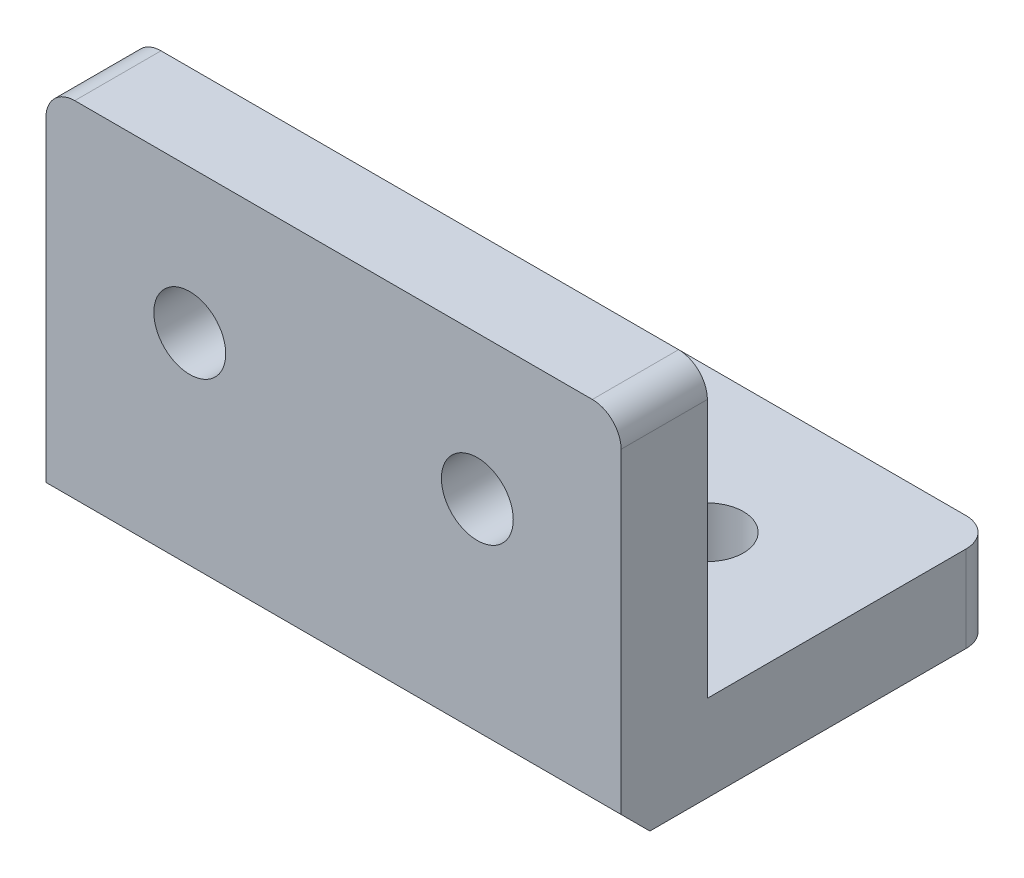
ISO-10303-21;
HEADER;
FILE_DESCRIPTION(('STEP AP214'),'2;1');
FILE_NAME('part.step','',(''),(''),'','','');
FILE_SCHEMA(('AUTOMOTIVE_DESIGN { 1 0 10303 214 1 1 1 1 }'));
ENDSEC;
DATA;
#1=APPLICATION_CONTEXT('core data for automotive mechanical design processes');
#2=APPLICATION_PROTOCOL_DEFINITION('international standard','automotive_design',2000,#1);
#3=PRODUCT_CONTEXT('',#1,'mechanical');
#4=PRODUCT('Part','Part','',(#3));
#5=PRODUCT_RELATED_PRODUCT_CATEGORY('part','',(#4));
#6=PRODUCT_DEFINITION_FORMATION('','',#4);
#7=PRODUCT_DEFINITION_CONTEXT('part definition',#1,'design');
#8=PRODUCT_DEFINITION('design','',#6,#7);
#9=PRODUCT_DEFINITION_SHAPE('','',#8);
#10=(LENGTH_UNIT() NAMED_UNIT(*) SI_UNIT(.MILLI.,.METRE.));
#11=(NAMED_UNIT(*) PLANE_ANGLE_UNIT() SI_UNIT($,.RADIAN.));
#12=(NAMED_UNIT(*) SI_UNIT($,.STERADIAN.) SOLID_ANGLE_UNIT());
#13=UNCERTAINTY_MEASURE_WITH_UNIT(LENGTH_MEASURE(1.E-05),#10,'distance_accuracy_value','');
#14=(GEOMETRIC_REPRESENTATION_CONTEXT(3) GLOBAL_UNCERTAINTY_ASSIGNED_CONTEXT((#13)) GLOBAL_UNIT_ASSIGNED_CONTEXT((#10,
#11,#12)) REPRESENTATION_CONTEXT('',''));
#15=CARTESIAN_POINT('',(0.,0.,0.));
#16=DIRECTION('',(0.,0.,1.));
#17=DIRECTION('',(1.,0.,0.));
#18=AXIS2_PLACEMENT_3D('',#15,#16,#17);
#19=CARTESIAN_POINT('',(-19.9999999999968,-9.25000000000114,6.00000000000178));
#20=DIRECTION('',(1.00000000000008,0.,0.));
#21=DIRECTION('',(0.,1.,0.));
#22=AXIS2_PLACEMENT_3D('',#19,#20,#21);
#23=PLANE('',#22);
#24=DIRECTION('',(0.,0.,1.));
#25=VECTOR('',#24,1.);
#26=CARTESIAN_POINT('',(-20.0000000000049,-15.2499999999981,-20.0000000000016));
#27=LINE('',#26,#25);
#28=CARTESIAN_POINT('',(-19.9999999999988,-15.2499999999955,-18.0000000000015));
#29=VERTEX_POINT('',#28);
#30=CARTESIAN_POINT('',(-19.9999999999968,-15.2500000000014,4.00000000000156));
#31=VERTEX_POINT('',#30);
#32=EDGE_CURVE('E144',#29,#31,#27,.T.);
#33=ORIENTED_EDGE('',*,*,#32,.T.);
#34=DIRECTION('',(0.,0.707106781186552,0.707106781186555));
#35=VECTOR('',#34,1.);
#36=CARTESIAN_POINT('',(-19.999999999998,-13.2500000000011,5.99999999999795));
#37=LINE('',#36,#35);
#38=CARTESIAN_POINT('',(-19.999999999998,-13.2500000000011,5.99999999999795));
#39=VERTEX_POINT('',#38);
#40=EDGE_CURVE('E11',#31,#39,#37,.T.);
#41=ORIENTED_EDGE('',*,*,#40,.T.);
#42=DIRECTION('',(0.,-1.,0.));
#43=VECTOR('',#42,1.);
#44=CARTESIAN_POINT('',(-19.9999999999968,-9.25000000000114,6.00000000000178));
#45=LINE('',#44,#43);
#46=CARTESIAN_POINT('',(-19.9999999999984,8.75000000000076,5.999999999999));
#47=VERTEX_POINT('',#46);
#48=EDGE_CURVE('E204',#47,#39,#45,.T.);
#49=ORIENTED_EDGE('',*,*,#48,.F.);
#50=DIRECTION('',(0.,0.,-1.));
#51=VECTOR('',#50,1.);
#52=CARTESIAN_POINT('',(-19.9999999999984,8.75000000000076,5.999999999999));
#53=LINE('',#52,#51);
#54=CARTESIAN_POINT('',(-19.9999999999982,8.75000000000153,-9.99200722162641E-13));
#55=VERTEX_POINT('',#54);
#56=EDGE_CURVE('E224',#47,#55,#53,.T.);
#57=ORIENTED_EDGE('',*,*,#56,.T.);
#58=DIRECTION('',(0.,-1.,0.));
#59=VECTOR('',#58,1.);
#60=CARTESIAN_POINT('',(-19.9999999999974,-9.25000000000209,1.77635683940025E-12));
#61=LINE('',#60,#59);
#62=CARTESIAN_POINT('',(-19.9999999999974,-9.25000000000209,1.77635683940025E-12));
#63=VERTEX_POINT('',#62);
#64=EDGE_CURVE('E200',#55,#63,#61,.T.);
#65=ORIENTED_EDGE('',*,*,#64,.T.);
#66=DIRECTION('',(0.,0.,1.));
#67=VECTOR('',#66,1.);
#68=CARTESIAN_POINT('',(-20.0000000000016,-9.24999999999809,-20.));
#69=LINE('',#68,#67);
#70=CARTESIAN_POINT('',(-20.0000000000026,-9.24999999999548,-18.));
#71=VERTEX_POINT('',#70);
#72=EDGE_CURVE('E181',#71,#63,#69,.T.);
#73=ORIENTED_EDGE('',*,*,#72,.F.);
#74=DIRECTION('',(0.,-1.,0.));
#75=VECTOR('',#74,1.);
#76=CARTESIAN_POINT('',(-19.999999999999,10.7500000000049,-18.000000000003));
#77=LINE('',#76,#75);
#78=EDGE_CURVE('E146',#71,#29,#77,.T.);
#79=ORIENTED_EDGE('',*,*,#78,.T.);
#80=EDGE_LOOP('',(#33,#41,#49,#57,#65,#73,#79));
#81=FACE_BOUND('',#80,.T.);
#82=ADVANCED_FACE('F38',(#81),#23,.F.);
#83=CARTESIAN_POINT('',(20.0000000000066,-9.25000000000498,5.99999999999262));
#84=DIRECTION('',(-1.00000000000008,0.,0.));
#85=DIRECTION('',(0.,-1.,0.));
#86=AXIS2_PLACEMENT_3D('',#83,#84,#85);
#87=PLANE('',#86);
#88=DIRECTION('',(0.,1.,0.));
#89=VECTOR('',#88,1.);
#90=CARTESIAN_POINT('',(20.0000000000066,-9.25000000000498,5.99999999999262));
#91=LINE('',#90,#89);
#92=CARTESIAN_POINT('',(20.0000000000083,-13.250000000005,5.99999999998996));
#93=VERTEX_POINT('',#92);
#94=CARTESIAN_POINT('',(20.0000000000068,8.74999999999743,5.99999999999162));
#95=VERTEX_POINT('',#94);
#96=EDGE_CURVE('E208',#93,#95,#91,.T.);
#97=ORIENTED_EDGE('',*,*,#96,.F.);
#98=DIRECTION('',(0.,-0.707106781186552,-0.707106781186555));
#99=VECTOR('',#98,1.);
#100=CARTESIAN_POINT('',(20.0000000000083,-13.250000000005,5.99999999998996));
#101=LINE('',#100,#99);
#102=CARTESIAN_POINT('',(20.0000000000119,-15.250000000004,3.99999999999179));
#103=VERTEX_POINT('',#102);
#104=EDGE_CURVE('E268',#93,#103,#101,.T.);
#105=ORIENTED_EDGE('',*,*,#104,.T.);
#106=DIRECTION('',(0.,0.,1.));
#107=VECTOR('',#106,1.);
#108=CARTESIAN_POINT('',(19.9999999999986,-15.2500000000024,-20.0000000000082));
#109=LINE('',#108,#107);
#110=CARTESIAN_POINT('',(20.0000000000012,-15.2500000000017,-18.0000000000082));
#111=VERTEX_POINT('',#110);
#112=EDGE_CURVE('E175',#111,#103,#109,.T.);
#113=ORIENTED_EDGE('',*,*,#112,.F.);
#114=DIRECTION('',(0.,-1.,0.));
#115=VECTOR('',#114,1.);
#116=CARTESIAN_POINT('',(20.0000000000046,10.7500000000024,-18.0000000000118));
#117=LINE('',#116,#115);
#118=CARTESIAN_POINT('',(20.0000000000001,-9.25000000000215,-18.0000000000086));
#119=VERTEX_POINT('',#118);
#120=EDGE_CURVE('E147',#119,#111,#117,.T.);
#121=ORIENTED_EDGE('',*,*,#120,.F.);
#122=DIRECTION('',(0.,0.,1.));
#123=VECTOR('',#122,1.);
#124=CARTESIAN_POINT('',(20.0000000000028,-9.25000000000237,-20.0000000000086));
#125=LINE('',#124,#123);
#126=CARTESIAN_POINT('',(20.0000000000068,-9.25000000000215,-7.38298311375729E-12));
#127=VERTEX_POINT('',#126);
#128=EDGE_CURVE('E139',#119,#127,#125,.T.);
#129=ORIENTED_EDGE('',*,*,#128,.T.);
#130=DIRECTION('',(0.,1.,0.));
#131=VECTOR('',#130,1.);
#132=CARTESIAN_POINT('',(20.0000000000068,-9.25000000000215,-7.38298311375729E-12));
#133=LINE('',#132,#131);
#134=CARTESIAN_POINT('',(20.0000000000079,8.74999999999942,-8.38218383591993E-12));
#135=VERTEX_POINT('',#134);
#136=EDGE_CURVE('E231',#127,#135,#133,.T.);
#137=ORIENTED_EDGE('',*,*,#136,.T.);
#138=DIRECTION('',(0.,0.,-1.));
#139=VECTOR('',#138,1.);
#140=CARTESIAN_POINT('',(20.0000000000068,8.74999999999743,5.99999999999162));
#141=LINE('',#140,#139);
#142=EDGE_CURVE('E132',#95,#135,#141,.T.);
#143=ORIENTED_EDGE('',*,*,#142,.F.);
#144=EDGE_LOOP('',(#97,#105,#113,#121,#129,#137,#143));
#145=FACE_BOUND('',#144,.T.);
#146=ADVANCED_FACE('F319',(#145),#87,.F.);
#147=CARTESIAN_POINT('',(19.9999999999986,-15.2500000000024,-20.0000000000082));
#148=DIRECTION('',(0.,-1.,0.));
#149=DIRECTION('',(1.00000000000008,0.,0.));
#150=AXIS2_PLACEMENT_3D('',#147,#148,#149);
#151=PLANE('',#150);
#152=CARTESIAN_POINT('',(10.0000000000036,-15.2500000000013,-10.0000000000022));
#153=DIRECTION('',(0.,-1.,0.));
#154=DIRECTION('',(1.00000000000008,0.,0.));
#155=AXIS2_PLACEMENT_3D('',#152,#153,#154);
#156=CIRCLE('',#155,2.5);
#157=CARTESIAN_POINT('',(12.5000000000033,-15.2500000000012,-10.0000000000035));
#158=VERTEX_POINT('',#157);
#159=EDGE_CURVE('E152',#158,#158,#156,.T.);
#160=ORIENTED_EDGE('',*,*,#159,.F.);
#161=EDGE_LOOP('',(#160));
#162=FACE_BOUND('',#161,.T.);
#163=CARTESIAN_POINT('',(-10.0000000000051,-15.2500000000007,-10.0000000000026));
#164=DIRECTION('',(0.,-1.,0.));
#165=DIRECTION('',(1.00000000000008,0.,0.));
#166=AXIS2_PLACEMENT_3D('',#163,#164,#165);
#167=CIRCLE('',#166,2.5);
#168=CARTESIAN_POINT('',(-7.50000000000145,-15.2500000000006,-10.0000000000043));
#169=VERTEX_POINT('',#168);
#170=EDGE_CURVE('E161',#169,#169,#167,.T.);
#171=ORIENTED_EDGE('',*,*,#170,.F.);
#172=EDGE_LOOP('',(#171));
#173=FACE_BOUND('',#172,.T.);
#174=ORIENTED_EDGE('',*,*,#112,.T.);
#175=DIRECTION('',(-1.00000000000008,0.,0.));
#176=VECTOR('',#175,1.);
#177=CARTESIAN_POINT('',(-19.9999999999968,-15.2500000000014,4.00000000000156));
#178=LINE('',#177,#176);
#179=EDGE_CURVE('E47',#103,#31,#178,.T.);
#180=ORIENTED_EDGE('',*,*,#179,.T.);
#181=ORIENTED_EDGE('',*,*,#32,.F.);
#182=CARTESIAN_POINT('',(-17.9999999999988,-15.249999999998,-18.0000000000064));
#183=DIRECTION('',(0.,-1.,0.));
#184=DIRECTION('',(1.00000000000008,0.,0.));
#185=AXIS2_PLACEMENT_3D('',#182,#183,#184);
#186=CIRCLE('',#185,2.);
#187=CARTESIAN_POINT('',(-18.0000000000049,-15.2499999999986,-20.0000000000064));
#188=VERTEX_POINT('',#187);
#189=EDGE_CURVE('E124',#188,#29,#186,.F.);
#190=ORIENTED_EDGE('',*,*,#189,.F.);
#191=DIRECTION('',(1.00000000000008,0.,0.));
#192=VECTOR('',#191,1.);
#193=CARTESIAN_POINT('',(19.9999999999986,-15.2500000000024,-20.0000000000082));
#194=LINE('',#193,#192);
#195=CARTESIAN_POINT('',(17.9999999999986,-15.249999999999,-20.0000000000087));
#196=VERTEX_POINT('',#195);
#197=EDGE_CURVE('E135',#188,#196,#194,.T.);
#198=ORIENTED_EDGE('',*,*,#197,.T.);
#199=CARTESIAN_POINT('',(18.0000000000012,-15.2499999999965,-18.0000000000087));
#200=DIRECTION('',(0.,-1.,0.));
#201=DIRECTION('',(1.00000000000008,0.,0.));
#202=AXIS2_PLACEMENT_3D('',#199,#200,#201);
#203=CIRCLE('',#202,2.);
#204=EDGE_CURVE('E155',#196,#111,#203,.T.);
#205=ORIENTED_EDGE('',*,*,#204,.T.);
#206=EDGE_LOOP('',(#174,#180,#181,#190,#198,#205));
#207=FACE_BOUND('',#206,.T.);
#208=ADVANCED_FACE('F142',(#162,#173,#207),#151,.T.);
#209=CARTESIAN_POINT('',(20.0000000000028,-9.25000000000237,-20.0000000000086));
#210=DIRECTION('',(0.,1.,0.));
#211=DIRECTION('',(-1.00000000000008,0.,0.));
#212=AXIS2_PLACEMENT_3D('',#209,#210,#211);
#213=PLANE('',#212);
#214=CARTESIAN_POINT('',(9.99999999999979,-9.25000000000126,-10.0000000000037));
#215=DIRECTION('',(0.,1.,0.));
#216=DIRECTION('',(-1.00000000000008,0.,0.));
#217=AXIS2_PLACEMENT_3D('',#214,#215,#216);
#218=CIRCLE('',#217,2.5);
#219=CARTESIAN_POINT('',(12.5000000000033,-9.25000000000122,-10.0000000000034));
#220=VERTEX_POINT('',#219);
#221=EDGE_CURVE('E173',#220,#220,#218,.T.);
#222=ORIENTED_EDGE('',*,*,#221,.F.);
#223=EDGE_LOOP('',(#222));
#224=FACE_BOUND('',#223,.T.);
#225=CARTESIAN_POINT('',(-10.0000000000018,-9.25000000000065,-10.0000000000066));
#226=DIRECTION('',(0.,1.,0.));
#227=DIRECTION('',(-1.00000000000008,0.,0.));
#228=AXIS2_PLACEMENT_3D('',#225,#226,#227);
#229=CIRCLE('',#228,2.5);
#230=CARTESIAN_POINT('',(-7.50000000000153,-9.25000000000061,-10.0000000000043));
#231=VERTEX_POINT('',#230);
#232=EDGE_CURVE('E171',#231,#231,#229,.T.);
#233=ORIENTED_EDGE('',*,*,#232,.F.);
#234=EDGE_LOOP('',(#233));
#235=FACE_BOUND('',#234,.T.);
#236=ORIENTED_EDGE('',*,*,#128,.F.);
#237=CARTESIAN_POINT('',(18.0000000000001,-9.24999999999715,-18.0000000000111));
#238=DIRECTION('',(0.,1.,0.));
#239=DIRECTION('',(-1.00000000000008,0.,0.));
#240=AXIS2_PLACEMENT_3D('',#237,#238,#239);
#241=CIRCLE('',#240,2.);
#242=CARTESIAN_POINT('',(18.0000000000028,-9.24999999999898,-20.0000000000111));
#243=VERTEX_POINT('',#242);
#244=EDGE_CURVE('E167',#119,#243,#241,.T.);
#245=ORIENTED_EDGE('',*,*,#244,.T.);
#246=DIRECTION('',(-1.00000000000008,0.,0.));
#247=VECTOR('',#246,1.);
#248=CARTESIAN_POINT('',(20.0000000000028,-9.25000000000237,-20.0000000000086));
#249=LINE('',#248,#247);
#250=CARTESIAN_POINT('',(-18.0000000000016,-9.24999999999859,-20.0000000000058));
#251=VERTEX_POINT('',#250);
#252=EDGE_CURVE('E140',#243,#251,#249,.T.);
#253=ORIENTED_EDGE('',*,*,#252,.T.);
#254=CARTESIAN_POINT('',(-18.0000000000026,-9.24999999999798,-18.0000000000058));
#255=DIRECTION('',(0.,1.,0.));
#256=DIRECTION('',(-1.00000000000008,0.,0.));
#257=AXIS2_PLACEMENT_3D('',#254,#255,#256);
#258=CIRCLE('',#257,2.);
#259=EDGE_CURVE('E126',#71,#251,#258,.F.);
#260=ORIENTED_EDGE('',*,*,#259,.F.);
#261=ORIENTED_EDGE('',*,*,#72,.T.);
#262=DIRECTION('',(1.00000000000008,0.,0.));
#263=VECTOR('',#262,1.);
#264=CARTESIAN_POINT('',(-19.9999999999974,-9.25000000000209,1.77635683940025E-12));
#265=LINE('',#264,#263);
#266=EDGE_CURVE('E228',#63,#127,#265,.T.);
#267=ORIENTED_EDGE('',*,*,#266,.T.);
#268=EDGE_LOOP('',(#236,#245,#253,#260,#261,#267));
#269=FACE_BOUND('',#268,.T.);
#270=ADVANCED_FACE('F318',(#224,#235,#269),#213,.T.);
#271=CARTESIAN_POINT('',(-5.10702591327572E-12,4.44089209850063E-12,-20.0000000000027));
#272=DIRECTION('',(0.,0.,-1.));
#273=DIRECTION('',(-1.00000000000008,0.,0.));
#274=AXIS2_PLACEMENT_3D('',#271,#272,#273);
#275=PLANE('',#274);
#276=ORIENTED_EDGE('',*,*,#252,.F.);
#277=DIRECTION('',(0.,-1.,0.));
#278=VECTOR('',#277,1.);
#279=CARTESIAN_POINT('',(18.000000000003,10.7500000000034,-20.0000000000068));
#280=LINE('',#279,#278);
#281=EDGE_CURVE('E131',#243,#196,#280,.T.);
#282=ORIENTED_EDGE('',*,*,#281,.T.);
#283=ORIENTED_EDGE('',*,*,#197,.F.);
#284=DIRECTION('',(0.,-1.,0.));
#285=VECTOR('',#284,1.);
#286=CARTESIAN_POINT('',(-18.0000000000003,10.7500000000054,-20.0000000000065));
#287=LINE('',#286,#285);
#288=EDGE_CURVE('E119',#188,#251,#287,.F.);
#289=ORIENTED_EDGE('',*,*,#288,.T.);
#290=EDGE_LOOP('',(#276,#282,#283,#289));
#291=FACE_BOUND('',#290,.T.);
#292=ADVANCED_FACE('F136',(#291),#275,.T.);
#293=CARTESIAN_POINT('',(-17.9999999999984,8.74999999999898,5.99999999999373));
#294=DIRECTION('',(0.,0.,-1.));
#295=DIRECTION('',(-1.00000000000008,0.,0.));
#296=AXIS2_PLACEMENT_3D('',#293,#294,#295);
#297=PLANE('',#296);
#298=ORIENTED_EDGE('',*,*,#48,.T.);
#299=DIRECTION('',(1.00000000000008,0.,0.));
#300=VECTOR('',#299,1.);
#301=CARTESIAN_POINT('',(20.0000000000083,-13.250000000005,5.99999999998996));
#302=LINE('',#301,#300);
#303=EDGE_CURVE('E259',#39,#93,#302,.T.);
#304=ORIENTED_EDGE('',*,*,#303,.T.);
#305=ORIENTED_EDGE('',*,*,#96,.T.);
#306=CARTESIAN_POINT('',(18.0000000000068,8.74999999999865,5.99999999999073));
#307=DIRECTION('',(0.,0.,1.));
#308=DIRECTION('',(-1.00000000000008,0.,0.));
#309=AXIS2_PLACEMENT_3D('',#306,#307,#308);
#310=CIRCLE('',#309,2.);
#311=CARTESIAN_POINT('',(18.0000000000063,10.7499999999987,5.99999999999257));
#312=VERTEX_POINT('',#311);
#313=EDGE_CURVE('E213',#95,#312,#310,.T.);
#314=ORIENTED_EDGE('',*,*,#313,.T.);
#315=DIRECTION('',(-1.00000000000008,0.,0.));
#316=VECTOR('',#315,1.);
#317=CARTESIAN_POINT('',(-17.9999999999988,10.749999999999,5.99999999999462));
#318=LINE('',#317,#316);
#319=CARTESIAN_POINT('',(-17.9999999999988,10.749999999999,5.99999999999462));
#320=VERTEX_POINT('',#319);
#321=EDGE_CURVE('E217',#312,#320,#318,.T.);
#322=ORIENTED_EDGE('',*,*,#321,.T.);
#323=CARTESIAN_POINT('',(-17.9999999999984,8.74999999999898,5.99999999999373));
#324=DIRECTION('',(0.,0.,1.));
#325=DIRECTION('',(-1.00000000000008,0.,0.));
#326=AXIS2_PLACEMENT_3D('',#323,#324,#325);
#327=CIRCLE('',#326,2.);
#328=EDGE_CURVE('E221',#320,#47,#327,.T.);
#329=ORIENTED_EDGE('',*,*,#328,.T.);
#330=EDGE_LOOP('',(#298,#304,#305,#314,#322,#329));
#331=FACE_BOUND('',#330,.T.);
#332=CARTESIAN_POINT('',(-9.99999999999646,0.749999999999418,6.));
#333=DIRECTION('',(0.,0.,1.));
#334=DIRECTION('',(1.00000000000008,0.,0.));
#335=AXIS2_PLACEMENT_3D('',#332,#333,#334);
#336=CIRCLE('',#335,2.5);
#337=CARTESIAN_POINT('',(-7.49999999999626,0.749999999999384,5.99999999999998));
#338=VERTEX_POINT('',#337);
#339=EDGE_CURVE('E196',#338,#338,#336,.T.);
#340=ORIENTED_EDGE('',*,*,#339,.F.);
#341=EDGE_LOOP('',(#340));
#342=FACE_BOUND('',#341,.T.);
#343=CARTESIAN_POINT('',(10.0000000000066,0.749999999999251,5.99999999999481));
#344=DIRECTION('',(0.,0.,1.));
#345=DIRECTION('',(1.00000000000008,0.,0.));
#346=AXIS2_PLACEMENT_3D('',#343,#344,#345);
#347=CIRCLE('',#346,2.5);
#348=CARTESIAN_POINT('',(12.5000000000068,0.749999999999217,5.99999999999478));
#349=VERTEX_POINT('',#348);
#350=EDGE_CURVE('E188',#349,#349,#347,.T.);
#351=ORIENTED_EDGE('',*,*,#350,.F.);
#352=EDGE_LOOP('',(#351));
#353=FACE_BOUND('',#352,.T.);
#354=ADVANCED_FACE('F361',(#331,#342,#353),#297,.F.);
#355=CARTESIAN_POINT('',(-17.9999999999982,8.74999999999843,-4.71844785465692E-12));
#356=DIRECTION('',(0.,0.,-1.));
#357=DIRECTION('',(-1.00000000000008,0.,0.));
#358=AXIS2_PLACEMENT_3D('',#355,#356,#357);
#359=PLANE('',#358);
#360=CARTESIAN_POINT('',(-9.99999999999968,0.75000000000075,-7.7715611723761E-13));
#361=DIRECTION('',(0.,0.,1.));
#362=DIRECTION('',(1.00000000000008,0.,0.));
#363=AXIS2_PLACEMENT_3D('',#360,#361,#362);
#364=CIRCLE('',#363,2.5);
#365=CARTESIAN_POINT('',(-7.49999999999948,0.750000000000716,-8.06195388225463E-13));
#366=VERTEX_POINT('',#365);
#367=EDGE_CURVE('E192',#366,#366,#364,.T.);
#368=ORIENTED_EDGE('',*,*,#367,.T.);
#369=EDGE_LOOP('',(#368));
#370=FACE_BOUND('',#369,.T.);
#371=ORIENTED_EDGE('',*,*,#64,.F.);
#372=CARTESIAN_POINT('',(-17.9999999999982,8.74999999999843,-4.71844785465692E-12));
#373=DIRECTION('',(0.,0.,1.));
#374=DIRECTION('',(-1.00000000000008,0.,0.));
#375=AXIS2_PLACEMENT_3D('',#372,#373,#374);
#376=CIRCLE('',#375,2.);
#377=CARTESIAN_POINT('',(-18.,10.7499999999984,-4.55191440096314E-12));
#378=VERTEX_POINT('',#377);
#379=EDGE_CURVE('E209',#378,#55,#376,.T.);
#380=ORIENTED_EDGE('',*,*,#379,.F.);
#381=DIRECTION('',(-1.00000000000008,0.,0.));
#382=VECTOR('',#381,1.);
#383=CARTESIAN_POINT('',(-18.,10.7499999999984,-4.55191440096314E-12));
#384=LINE('',#383,#382);
#385=CARTESIAN_POINT('',(18.0000000000068,10.7499999999998,-7.43849426498855E-12));
#386=VERTEX_POINT('',#385);
#387=EDGE_CURVE('E239',#386,#378,#384,.T.);
#388=ORIENTED_EDGE('',*,*,#387,.F.);
#389=CARTESIAN_POINT('',(18.0000000000079,8.74999999999981,-9.27036225562006E-12));
#390=DIRECTION('',(0.,0.,1.));
#391=DIRECTION('',(-1.00000000000008,0.,0.));
#392=AXIS2_PLACEMENT_3D('',#389,#390,#391);
#393=CIRCLE('',#392,2.);
#394=EDGE_CURVE('E235',#135,#386,#393,.T.);
#395=ORIENTED_EDGE('',*,*,#394,.F.);
#396=ORIENTED_EDGE('',*,*,#136,.F.);
#397=ORIENTED_EDGE('',*,*,#266,.F.);
#398=EDGE_LOOP('',(#371,#380,#388,#395,#396,#397));
#399=FACE_BOUND('',#398,.T.);
#400=CARTESIAN_POINT('',(10.0000000000037,0.750000000000028,-6.02295990859147E-12));
#401=DIRECTION('',(0.,0.,1.));
#402=DIRECTION('',(1.00000000000008,0.,0.));
#403=AXIS2_PLACEMENT_3D('',#400,#401,#402);
#404=CIRCLE('',#403,2.5);
#405=CARTESIAN_POINT('',(12.5000000000039,0.749999999999994,-6.05199917957933E-12));
#406=VERTEX_POINT('',#405);
#407=EDGE_CURVE('E178',#406,#406,#404,.T.);
#408=ORIENTED_EDGE('',*,*,#407,.T.);
#409=EDGE_LOOP('',(#408));
#410=FACE_BOUND('',#409,.T.);
#411=ADVANCED_FACE('F349',(#370,#399,#410),#359,.T.);
#412=CARTESIAN_POINT('',(18.0000000000068,8.74999999999865,5.99999999999073));
#413=DIRECTION('',(0.,0.,-1.));
#414=DIRECTION('',(-1.00000000000008,0.,0.));
#415=AXIS2_PLACEMENT_3D('',#412,#413,#414);
#416=CYLINDRICAL_SURFACE('',#415,2.);
#417=ORIENTED_EDGE('',*,*,#394,.T.);
#418=DIRECTION('',(0.,0.,-1.));
#419=VECTOR('',#418,1.);
#420=CARTESIAN_POINT('',(18.0000000000063,10.7499999999987,5.99999999999257));
#421=LINE('',#420,#419);
#422=EDGE_CURVE('E251',#312,#386,#421,.T.);
#423=ORIENTED_EDGE('',*,*,#422,.F.);
#424=ORIENTED_EDGE('',*,*,#313,.F.);
#425=ORIENTED_EDGE('',*,*,#142,.T.);
#426=EDGE_LOOP('',(#417,#423,#424,#425));
#427=FACE_BOUND('',#426,.T.);
#428=ADVANCED_FACE('F345',(#427),#416,.T.);
#429=CARTESIAN_POINT('',(-17.9999999999988,10.749999999999,5.99999999999462));
#430=DIRECTION('',(0.,-1.,0.));
#431=DIRECTION('',(1.00000000000008,0.,0.));
#432=AXIS2_PLACEMENT_3D('',#429,#430,#431);
#433=PLANE('',#432);
#434=ORIENTED_EDGE('',*,*,#387,.T.);
#435=DIRECTION('',(0.,0.,-1.));
#436=VECTOR('',#435,1.);
#437=CARTESIAN_POINT('',(-17.9999999999988,10.749999999999,5.99999999999462));
#438=LINE('',#437,#436);
#439=EDGE_CURVE('E248',#320,#378,#438,.T.);
#440=ORIENTED_EDGE('',*,*,#439,.F.);
#441=ORIENTED_EDGE('',*,*,#321,.F.);
#442=ORIENTED_EDGE('',*,*,#422,.T.);
#443=EDGE_LOOP('',(#434,#440,#441,#442));
#444=FACE_BOUND('',#443,.T.);
#445=ADVANCED_FACE('F348',(#444),#433,.F.);
#446=CARTESIAN_POINT('',(-17.9999999999984,8.74999999999898,5.99999999999373));
#447=DIRECTION('',(0.,0.,-1.));
#448=DIRECTION('',(-1.00000000000008,0.,0.));
#449=AXIS2_PLACEMENT_3D('',#446,#447,#448);
#450=CYLINDRICAL_SURFACE('',#449,2.);
#451=ORIENTED_EDGE('',*,*,#379,.T.);
#452=ORIENTED_EDGE('',*,*,#56,.F.);
#453=ORIENTED_EDGE('',*,*,#328,.F.);
#454=ORIENTED_EDGE('',*,*,#439,.T.);
#455=EDGE_LOOP('',(#451,#452,#453,#454));
#456=FACE_BOUND('',#455,.T.);
#457=ADVANCED_FACE('F353',(#456),#450,.T.);
#458=CARTESIAN_POINT('',(-9.99999999999646,0.749999999999418,6.));
#459=DIRECTION('',(0.,0.,-1.));
#460=DIRECTION('',(-1.00000000000008,0.,0.));
#461=AXIS2_PLACEMENT_3D('',#458,#459,#460);
#462=CYLINDRICAL_SURFACE('',#461,2.5);
#463=ORIENTED_EDGE('',*,*,#339,.T.);
#464=EDGE_LOOP('',(#463));
#465=FACE_BOUND('',#464,.T.);
#466=ORIENTED_EDGE('',*,*,#367,.F.);
#467=EDGE_LOOP('',(#466));
#468=FACE_BOUND('',#467,.T.);
#469=ADVANCED_FACE('F357',(#465,#468),#462,.F.);
#470=CARTESIAN_POINT('',(10.0000000000066,0.749999999999251,5.99999999999481));
#471=DIRECTION('',(0.,0.,-1.));
#472=DIRECTION('',(-1.00000000000008,0.,0.));
#473=AXIS2_PLACEMENT_3D('',#470,#471,#472);
#474=CYLINDRICAL_SURFACE('',#473,2.5);
#475=ORIENTED_EDGE('',*,*,#350,.T.);
#476=EDGE_LOOP('',(#475));
#477=FACE_BOUND('',#476,.T.);
#478=ORIENTED_EDGE('',*,*,#407,.F.);
#479=EDGE_LOOP('',(#478));
#480=FACE_BOUND('',#479,.T.);
#481=ADVANCED_FACE('F368',(#477,#480),#474,.F.);
#482=CARTESIAN_POINT('',(-17.999999999999,10.7500000000035,-18.0000000000065));
#483=DIRECTION('',(0.,-1.,0.));
#484=DIRECTION('',(1.00000000000008,0.,0.));
#485=AXIS2_PLACEMENT_3D('',#482,#483,#484);
#486=CYLINDRICAL_SURFACE('',#485,2.);
#487=ORIENTED_EDGE('',*,*,#259,.T.);
#488=ORIENTED_EDGE('',*,*,#288,.F.);
#489=ORIENTED_EDGE('',*,*,#189,.T.);
#490=ORIENTED_EDGE('',*,*,#78,.F.);
#491=EDGE_LOOP('',(#487,#488,#489,#490));
#492=FACE_BOUND('',#491,.T.);
#493=ADVANCED_FACE('F121',(#492),#486,.T.);
#494=CARTESIAN_POINT('',(18.0000000000046,10.7500000000034,-18.0000000000068));
#495=DIRECTION('',(0.,-1.,0.));
#496=DIRECTION('',(1.00000000000008,0.,0.));
#497=AXIS2_PLACEMENT_3D('',#494,#495,#496);
#498=CYLINDRICAL_SURFACE('',#497,2.);
#499=ORIENTED_EDGE('',*,*,#120,.T.);
#500=ORIENTED_EDGE('',*,*,#204,.F.);
#501=ORIENTED_EDGE('',*,*,#281,.F.);
#502=ORIENTED_EDGE('',*,*,#244,.F.);
#503=EDGE_LOOP('',(#499,#500,#501,#502));
#504=FACE_BOUND('',#503,.T.);
#505=ADVANCED_FACE('F325',(#504),#498,.T.);
#506=CARTESIAN_POINT('',(-10.000000000002,10.7499999999992,-10.000000000004));
#507=DIRECTION('',(0.,-1.,0.));
#508=DIRECTION('',(1.00000000000008,0.,0.));
#509=AXIS2_PLACEMENT_3D('',#506,#507,#508);
#510=CYLINDRICAL_SURFACE('',#509,2.5);
#511=CARTESIAN_POINT('',(-7.50000000000153,-9.25000000000061,-10.0000000000043));
#512=CARTESIAN_POINT('',(-7.50000000000153,-9.31250000000061,-10.0000000000043));
#513=CARTESIAN_POINT('',(-7.50000000000153,-9.37500000000061,-10.0000000000043));
#514=CARTESIAN_POINT('',(-7.50000000000153,-9.50000000000061,-10.0000000000043));
#515=CARTESIAN_POINT('',(-7.50000000000153,-9.56250000000061,-10.0000000000043));
#516=CARTESIAN_POINT('',(-7.50000000000153,-9.68750000000061,-10.0000000000043));
#517=CARTESIAN_POINT('',(-7.50000000000153,-9.75000000000061,-10.0000000000043));
#518=CARTESIAN_POINT('',(-7.50000000000152,-9.87500000000061,-10.0000000000043));
#519=CARTESIAN_POINT('',(-7.50000000000152,-9.93750000000061,-10.0000000000043));
#520=CARTESIAN_POINT('',(-7.50000000000152,-10.0625000000006,-10.0000000000043));
#521=CARTESIAN_POINT('',(-7.50000000000152,-10.1250000000006,-10.0000000000043));
#522=CARTESIAN_POINT('',(-7.50000000000152,-10.2500000000006,-10.0000000000043));
#523=CARTESIAN_POINT('',(-7.50000000000152,-10.3125000000006,-10.0000000000043));
#524=CARTESIAN_POINT('',(-7.50000000000152,-10.4375000000006,-10.0000000000043));
#525=CARTESIAN_POINT('',(-7.50000000000152,-10.5000000000006,-10.0000000000043));
#526=CARTESIAN_POINT('',(-7.50000000000151,-10.6250000000006,-10.0000000000043));
#527=CARTESIAN_POINT('',(-7.50000000000151,-10.6875000000006,-10.0000000000043));
#528=CARTESIAN_POINT('',(-7.50000000000151,-10.8125000000006,-10.0000000000043));
#529=CARTESIAN_POINT('',(-7.50000000000151,-10.8750000000006,-10.0000000000043));
#530=CARTESIAN_POINT('',(-7.50000000000151,-11.0000000000006,-10.0000000000043));
#531=CARTESIAN_POINT('',(-7.50000000000151,-11.0625000000006,-10.0000000000043));
#532=CARTESIAN_POINT('',(-7.50000000000151,-11.1875000000006,-10.0000000000043));
#533=CARTESIAN_POINT('',(-7.50000000000151,-11.2500000000006,-10.0000000000043));
#534=CARTESIAN_POINT('',(-7.5000000000015,-11.3750000000006,-10.0000000000043));
#535=CARTESIAN_POINT('',(-7.5000000000015,-11.4375000000006,-10.0000000000043));
#536=CARTESIAN_POINT('',(-7.5000000000015,-11.5625000000006,-10.0000000000043));
#537=CARTESIAN_POINT('',(-7.5000000000015,-11.6250000000006,-10.0000000000043));
#538=CARTESIAN_POINT('',(-7.5000000000015,-11.7500000000006,-10.0000000000043));
#539=CARTESIAN_POINT('',(-7.5000000000015,-11.8125000000006,-10.0000000000043));
#540=CARTESIAN_POINT('',(-7.5000000000015,-11.9375000000006,-10.0000000000043));
#541=CARTESIAN_POINT('',(-7.50000000000149,-12.0000000000006,-10.0000000000043));
#542=CARTESIAN_POINT('',(-7.50000000000149,-12.1250000000006,-10.0000000000043));
#543=CARTESIAN_POINT('',(-7.50000000000149,-12.1875000000006,-10.0000000000043));
#544=CARTESIAN_POINT('',(-7.50000000000149,-12.3125000000006,-10.0000000000043));
#545=CARTESIAN_POINT('',(-7.50000000000149,-12.3750000000006,-10.0000000000043));
#546=CARTESIAN_POINT('',(-7.50000000000149,-12.5000000000006,-10.0000000000043));
#547=CARTESIAN_POINT('',(-7.50000000000149,-12.5625000000006,-10.0000000000043));
#548=CARTESIAN_POINT('',(-7.50000000000149,-12.6875000000006,-10.0000000000043));
#549=CARTESIAN_POINT('',(-7.50000000000149,-12.7500000000006,-10.0000000000043));
#550=CARTESIAN_POINT('',(-7.50000000000148,-12.8750000000006,-10.0000000000043));
#551=CARTESIAN_POINT('',(-7.50000000000148,-12.9375000000006,-10.0000000000043));
#552=CARTESIAN_POINT('',(-7.50000000000148,-13.0625000000006,-10.0000000000043));
#553=CARTESIAN_POINT('',(-7.50000000000148,-13.1250000000006,-10.0000000000043));
#554=CARTESIAN_POINT('',(-7.50000000000148,-13.2500000000006,-10.0000000000043));
#555=CARTESIAN_POINT('',(-7.50000000000148,-13.3125000000006,-10.0000000000043));
#556=CARTESIAN_POINT('',(-7.50000000000148,-13.4375000000006,-10.0000000000043));
#557=CARTESIAN_POINT('',(-7.50000000000147,-13.5000000000006,-10.0000000000043));
#558=CARTESIAN_POINT('',(-7.50000000000147,-13.6250000000006,-10.0000000000043));
#559=CARTESIAN_POINT('',(-7.50000000000147,-13.6875000000006,-10.0000000000043));
#560=CARTESIAN_POINT('',(-7.50000000000147,-13.8125000000006,-10.0000000000043));
#561=CARTESIAN_POINT('',(-7.50000000000147,-13.8750000000006,-10.0000000000043));
#562=CARTESIAN_POINT('',(-7.50000000000147,-14.0000000000006,-10.0000000000043));
#563=CARTESIAN_POINT('',(-7.50000000000147,-14.0625000000006,-10.0000000000043));
#564=CARTESIAN_POINT('',(-7.50000000000146,-14.1875000000006,-10.0000000000043));
#565=CARTESIAN_POINT('',(-7.50000000000146,-14.2500000000006,-10.0000000000043));
#566=CARTESIAN_POINT('',(-7.50000000000146,-14.3750000000006,-10.0000000000043));
#567=CARTESIAN_POINT('',(-7.50000000000146,-14.4375000000006,-10.0000000000043));
#568=CARTESIAN_POINT('',(-7.50000000000146,-14.5625000000006,-10.0000000000043));
#569=CARTESIAN_POINT('',(-7.50000000000146,-14.6250000000006,-10.0000000000043));
#570=CARTESIAN_POINT('',(-7.50000000000146,-14.7500000000006,-10.0000000000043));
#571=CARTESIAN_POINT('',(-7.50000000000146,-14.8125000000006,-10.0000000000043));
#572=CARTESIAN_POINT('',(-7.50000000000145,-14.9375000000006,-10.0000000000043));
#573=CARTESIAN_POINT('',(-7.50000000000145,-15.0000000000006,-10.0000000000043));
#574=CARTESIAN_POINT('',(-7.50000000000145,-15.1250000000006,-10.0000000000043));
#575=CARTESIAN_POINT('',(-7.50000000000145,-15.1875000000006,-10.0000000000043));
#576=CARTESIAN_POINT('',(-7.50000000000145,-15.2500000000006,-10.0000000000043));
#577=B_SPLINE_CURVE_WITH_KNOTS('',3,(#511,#512,#513,#514,#515,#516,#517,#518,#519,#520,#521,
#522,#523,#524,#525,#526,#527,#528,#529,#530,#531,#532,#533,#534,#535,#536,#537,#538,#539,#540,
#541,#542,#543,#544,#545,#546,#547,#548,#549,#550,#551,#552,#553,#554,#555,#556,#557,#558,#559,
#560,#561,#562,#563,#564,#565,#566,#567,#568,#569,#570,#571,#572,#573,#574,#575,#576),
.UNSPECIFIED.,.F.,.F.,(4,2,2,2,2,2,2,2,2,2,2,2,2,2,2,2,2,2,2,2,2,2,2,2,2,2,2,2,2,2,2,2,4),(0.,
0.1875,0.375,0.5625,0.750000000000001,0.937500000000001,1.125,1.3125,1.5,1.6875,1.875,2.0625,
2.25,2.4375,2.625,2.8125,3.,3.1875,3.375,3.5625,3.75,3.9375,4.125,4.3125,4.5,4.6875,4.875,
5.0625,5.25,5.4375,5.62500000000001,5.81250000000001,6.00000000000001),.UNSPECIFIED.);
#578=EDGE_CURVE('BSEAM323',#231,#169,#577,.T.);
#579=ORIENTED_EDGE('',*,*,#232,.T.);
#580=ORIENTED_EDGE('',*,*,#170,.T.);
#581=ORIENTED_EDGE('',*,*,#578,.T.);
#582=ORIENTED_EDGE('',*,*,#578,.F.);
#583=EDGE_LOOP('',(#579,#581,#580,#582));
#584=FACE_BOUND('',#583,.T.);
#585=ADVANCED_FACE('F323',(#584),#510,.F.);
#586=CARTESIAN_POINT('',(10.0000000000028,10.7500000000006,-10.0000000000031));
#587=DIRECTION('',(0.,-1.,0.));
#588=DIRECTION('',(1.00000000000008,0.,0.));
#589=AXIS2_PLACEMENT_3D('',#586,#587,#588);
#590=CYLINDRICAL_SURFACE('',#589,2.5);
#591=CARTESIAN_POINT('',(12.5000000000033,-9.25000000000122,-10.0000000000034));
#592=CARTESIAN_POINT('',(12.5000000000033,-9.31250000000122,-10.0000000000034));
#593=CARTESIAN_POINT('',(12.5000000000033,-9.37500000000122,-10.0000000000034));
#594=CARTESIAN_POINT('',(12.5000000000033,-9.50000000000122,-10.0000000000034));
#595=CARTESIAN_POINT('',(12.5000000000033,-9.56250000000122,-10.0000000000034));
#596=CARTESIAN_POINT('',(12.5000000000033,-9.68750000000122,-10.0000000000034));
#597=CARTESIAN_POINT('',(12.5000000000033,-9.75000000000122,-10.0000000000034));
#598=CARTESIAN_POINT('',(12.5000000000033,-9.87500000000123,-10.0000000000034));
#599=CARTESIAN_POINT('',(12.5000000000033,-9.93750000000123,-10.0000000000034));
#600=CARTESIAN_POINT('',(12.5000000000033,-10.0625000000012,-10.0000000000034));
#601=CARTESIAN_POINT('',(12.5000000000033,-10.1250000000012,-10.0000000000034));
#602=CARTESIAN_POINT('',(12.5000000000033,-10.2500000000012,-10.0000000000034));
#603=CARTESIAN_POINT('',(12.5000000000033,-10.3125000000012,-10.0000000000034));
#604=CARTESIAN_POINT('',(12.5000000000033,-10.4375000000012,-10.0000000000034));
#605=CARTESIAN_POINT('',(12.5000000000033,-10.5000000000012,-10.0000000000034));
#606=CARTESIAN_POINT('',(12.5000000000033,-10.6250000000012,-10.0000000000034));
#607=CARTESIAN_POINT('',(12.5000000000033,-10.6875000000012,-10.0000000000034));
#608=CARTESIAN_POINT('',(12.5000000000033,-10.8125000000012,-10.0000000000034));
#609=CARTESIAN_POINT('',(12.5000000000033,-10.8750000000012,-10.0000000000034));
#610=CARTESIAN_POINT('',(12.5000000000033,-11.0000000000012,-10.0000000000034));
#611=CARTESIAN_POINT('',(12.5000000000033,-11.0625000000012,-10.0000000000034));
#612=CARTESIAN_POINT('',(12.5000000000033,-11.1875000000012,-10.0000000000034));
#613=CARTESIAN_POINT('',(12.5000000000033,-11.2500000000012,-10.0000000000034));
#614=CARTESIAN_POINT('',(12.5000000000033,-11.3750000000012,-10.0000000000034));
#615=CARTESIAN_POINT('',(12.5000000000033,-11.4375000000012,-10.0000000000034));
#616=CARTESIAN_POINT('',(12.5000000000033,-11.5625000000012,-10.0000000000034));
#617=CARTESIAN_POINT('',(12.5000000000033,-11.6250000000012,-10.0000000000034));
#618=CARTESIAN_POINT('',(12.5000000000033,-11.7500000000012,-10.0000000000034));
#619=CARTESIAN_POINT('',(12.5000000000033,-11.8125000000012,-10.0000000000034));
#620=CARTESIAN_POINT('',(12.5000000000033,-11.9375000000012,-10.0000000000034));
#621=CARTESIAN_POINT('',(12.5000000000033,-12.0000000000012,-10.0000000000034));
#622=CARTESIAN_POINT('',(12.5000000000033,-12.1250000000012,-10.0000000000034));
#623=CARTESIAN_POINT('',(12.5000000000033,-12.1875000000012,-10.0000000000034));
#624=CARTESIAN_POINT('',(12.5000000000033,-12.3125000000012,-10.0000000000034));
#625=CARTESIAN_POINT('',(12.5000000000033,-12.3750000000012,-10.0000000000034));
#626=CARTESIAN_POINT('',(12.5000000000033,-12.5000000000012,-10.0000000000034));
#627=CARTESIAN_POINT('',(12.5000000000033,-12.5625000000012,-10.0000000000034));
#628=CARTESIAN_POINT('',(12.5000000000033,-12.6875000000012,-10.0000000000034));
#629=CARTESIAN_POINT('',(12.5000000000033,-12.7500000000012,-10.0000000000034));
#630=CARTESIAN_POINT('',(12.5000000000033,-12.8750000000012,-10.0000000000034));
#631=CARTESIAN_POINT('',(12.5000000000033,-12.9375000000012,-10.0000000000034));
#632=CARTESIAN_POINT('',(12.5000000000033,-13.0625000000012,-10.0000000000035));
#633=CARTESIAN_POINT('',(12.5000000000033,-13.1250000000012,-10.0000000000035));
#634=CARTESIAN_POINT('',(12.5000000000033,-13.2500000000012,-10.0000000000035));
#635=CARTESIAN_POINT('',(12.5000000000033,-13.3125000000012,-10.0000000000035));
#636=CARTESIAN_POINT('',(12.5000000000033,-13.4375000000012,-10.0000000000035));
#637=CARTESIAN_POINT('',(12.5000000000033,-13.5000000000012,-10.0000000000035));
#638=CARTESIAN_POINT('',(12.5000000000033,-13.6250000000012,-10.0000000000035));
#639=CARTESIAN_POINT('',(12.5000000000033,-13.6875000000012,-10.0000000000035));
#640=CARTESIAN_POINT('',(12.5000000000033,-13.8125000000012,-10.0000000000035));
#641=CARTESIAN_POINT('',(12.5000000000033,-13.8750000000012,-10.0000000000035));
#642=CARTESIAN_POINT('',(12.5000000000033,-14.0000000000012,-10.0000000000035));
#643=CARTESIAN_POINT('',(12.5000000000033,-14.0625000000012,-10.0000000000035));
#644=CARTESIAN_POINT('',(12.5000000000033,-14.1875000000012,-10.0000000000035));
#645=CARTESIAN_POINT('',(12.5000000000033,-14.2500000000012,-10.0000000000035));
#646=CARTESIAN_POINT('',(12.5000000000033,-14.3750000000012,-10.0000000000035));
#647=CARTESIAN_POINT('',(12.5000000000033,-14.4375000000012,-10.0000000000035));
#648=CARTESIAN_POINT('',(12.5000000000033,-14.5625000000012,-10.0000000000035));
#649=CARTESIAN_POINT('',(12.5000000000033,-14.6250000000012,-10.0000000000035));
#650=CARTESIAN_POINT('',(12.5000000000033,-14.7500000000012,-10.0000000000035));
#651=CARTESIAN_POINT('',(12.5000000000033,-14.8125000000012,-10.0000000000035));
#652=CARTESIAN_POINT('',(12.5000000000033,-14.9375000000012,-10.0000000000035));
#653=CARTESIAN_POINT('',(12.5000000000033,-15.0000000000012,-10.0000000000035));
#654=CARTESIAN_POINT('',(12.5000000000033,-15.1250000000012,-10.0000000000035));
#655=CARTESIAN_POINT('',(12.5000000000033,-15.1875000000012,-10.0000000000035));
#656=CARTESIAN_POINT('',(12.5000000000033,-15.2500000000012,-10.0000000000035));
#657=B_SPLINE_CURVE_WITH_KNOTS('',3,(#591,#592,#593,#594,#595,#596,#597,#598,#599,#600,#601,
#602,#603,#604,#605,#606,#607,#608,#609,#610,#611,#612,#613,#614,#615,#616,#617,#618,#619,#620,
#621,#622,#623,#624,#625,#626,#627,#628,#629,#630,#631,#632,#633,#634,#635,#636,#637,#638,#639,
#640,#641,#642,#643,#644,#645,#646,#647,#648,#649,#650,#651,#652,#653,#654,#655,#656),
.UNSPECIFIED.,.F.,.F.,(4,2,2,2,2,2,2,2,2,2,2,2,2,2,2,2,2,2,2,2,2,2,2,2,2,2,2,2,2,2,2,2,4),(0.,
0.1875,0.375,0.5625,0.750000000000001,0.937500000000001,1.125,1.3125,1.5,1.6875,1.875,2.0625,
2.25,2.4375,2.625,2.8125,3.,3.1875,3.375,3.5625,3.75,3.9375,4.125,4.3125,4.5,4.6875,4.875,
5.0625,5.25,5.4375,5.62500000000001,5.81250000000001,6.00000000000001),.UNSPECIFIED.);
#658=EDGE_CURVE('BSEAM314',#220,#158,#657,.T.);
#659=ORIENTED_EDGE('',*,*,#221,.T.);
#660=ORIENTED_EDGE('',*,*,#159,.T.);
#661=ORIENTED_EDGE('',*,*,#658,.T.);
#662=ORIENTED_EDGE('',*,*,#658,.F.);
#663=EDGE_LOOP('',(#659,#661,#660,#662));
#664=FACE_BOUND('',#663,.T.);
#665=ADVANCED_FACE('F314',(#664),#590,.F.);
#666=CARTESIAN_POINT('',(-17.999999999998,-13.2500000000036,5.99999999999662));
#667=DIRECTION('',(0.,-0.707106781186543,0.70710678118654));
#668=DIRECTION('',(-1.00000000000008,0.,0.));
#669=AXIS2_PLACEMENT_3D('',#666,#667,#668);
#670=PLANE('',#669);
#671=ORIENTED_EDGE('',*,*,#40,.F.);
#672=ORIENTED_EDGE('',*,*,#179,.F.);
#673=ORIENTED_EDGE('',*,*,#104,.F.);
#674=ORIENTED_EDGE('',*,*,#303,.F.);
#675=EDGE_LOOP('',(#671,#672,#673,#674));
#676=FACE_BOUND('',#675,.T.);
#677=ADVANCED_FACE('F40',(#676),#670,.T.);
#678=CLOSED_SHELL('',(#82,#146,#208,#270,#292,#354,#411,#428,#445,#457,#469,#481,#493,#505,#585,
#665,#677));
#679=MANIFOLD_SOLID_BREP('B2',#678);
#680=ADVANCED_BREP_SHAPE_REPRESENTATION('',(#18,#679),#14);
#681=SHAPE_DEFINITION_REPRESENTATION(#9,#680);
ENDSEC;
END-ISO-10303-21;
